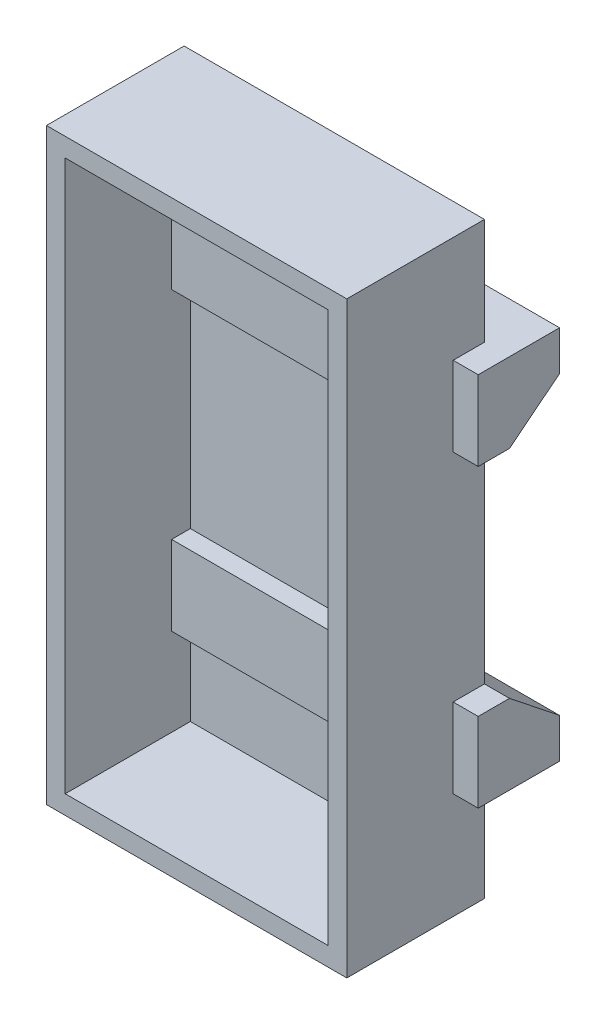
ISO-10303-21;
HEADER;
FILE_DESCRIPTION(('STEP AP214'),'2;1');
FILE_NAME('part.step','',(''),(''),'','','');
FILE_SCHEMA(('AUTOMOTIVE_DESIGN { 1 0 10303 214 1 1 1 1 }'));
ENDSEC;
DATA;
#1=APPLICATION_CONTEXT('core data for automotive mechanical design processes');
#2=APPLICATION_PROTOCOL_DEFINITION('international standard','automotive_design',2000,#1);
#3=PRODUCT_CONTEXT('',#1,'mechanical');
#4=PRODUCT('Part','Part','',(#3));
#5=PRODUCT_RELATED_PRODUCT_CATEGORY('part','',(#4));
#6=PRODUCT_DEFINITION_FORMATION('','',#4);
#7=PRODUCT_DEFINITION_CONTEXT('part definition',#1,'design');
#8=PRODUCT_DEFINITION('design','',#6,#7);
#9=PRODUCT_DEFINITION_SHAPE('','',#8);
#10=(LENGTH_UNIT() NAMED_UNIT(*) SI_UNIT(.MILLI.,.METRE.));
#11=(NAMED_UNIT(*) PLANE_ANGLE_UNIT() SI_UNIT($,.RADIAN.));
#12=(NAMED_UNIT(*) SI_UNIT($,.STERADIAN.) SOLID_ANGLE_UNIT());
#13=UNCERTAINTY_MEASURE_WITH_UNIT(LENGTH_MEASURE(1.E-05),#10,'distance_accuracy_value','');
#14=(GEOMETRIC_REPRESENTATION_CONTEXT(3) GLOBAL_UNCERTAINTY_ASSIGNED_CONTEXT((#13)) GLOBAL_UNIT_ASSIGNED_CONTEXT((#10,
#11,#12)) REPRESENTATION_CONTEXT('',''));
#15=CARTESIAN_POINT('',(0.,0.,0.));
#16=DIRECTION('',(0.,0.,1.));
#17=DIRECTION('',(1.,0.,0.));
#18=AXIS2_PLACEMENT_3D('',#15,#16,#17);
#19=CARTESIAN_POINT('',(1.1371151592628,-35.5645357115203,-4.));
#20=DIRECTION('',(0.,-1.,0.));
#21=DIRECTION('',(1.,0.,0.));
#22=AXIS2_PLACEMENT_3D('',#19,#20,#21);
#23=PLANE('',#22);
#24=DIRECTION('',(-1.,0.,0.));
#25=VECTOR('',#24,1.);
#26=CARTESIAN_POINT('',(8.13711515926281,-35.5645357115203,0.));
#27=LINE('',#26,#25);
#28=CARTESIAN_POINT('',(1.1371151592628,-35.5645357115203,0.));
#29=VERTEX_POINT('',#28);
#30=CARTESIAN_POINT('',(-0.862884840737202,-35.5645357115203,0.));
#31=VERTEX_POINT('',#30);
#32=EDGE_CURVE('E270',#29,#31,#27,.T.);
#33=ORIENTED_EDGE('',*,*,#32,.F.);
#34=DIRECTION('',(0.,0.,1.));
#35=VECTOR('',#34,1.);
#36=CARTESIAN_POINT('',(1.1371151592628,-35.5645357115203,-4.));
#37=LINE('',#36,#35);
#38=CARTESIAN_POINT('',(1.1371151592628,-35.5645357115203,2.5));
#39=VERTEX_POINT('',#38);
#40=EDGE_CURVE('E347',#29,#39,#37,.T.);
#41=ORIENTED_EDGE('',*,*,#40,.T.);
#42=DIRECTION('',(-1.,0.,0.));
#43=VECTOR('',#42,1.);
#44=CARTESIAN_POINT('',(1.1371151592628,-35.5645357115203,2.5));
#45=LINE('',#44,#43);
#46=CARTESIAN_POINT('',(-0.862884840737204,-35.5645357115203,2.5));
#47=VERTEX_POINT('',#46);
#48=EDGE_CURVE('E363',#39,#47,#45,.T.);
#49=ORIENTED_EDGE('',*,*,#48,.T.);
#50=DIRECTION('',(0.,0.,1.));
#51=VECTOR('',#50,1.);
#52=CARTESIAN_POINT('',(-0.862884840737205,-35.5645357115203,11.));
#53=LINE('',#52,#51);
#54=EDGE_CURVE('E373',#31,#47,#53,.T.);
#55=ORIENTED_EDGE('',*,*,#54,.F.);
#56=EDGE_LOOP('',(#33,#41,#49,#55));
#57=FACE_BOUND('',#56,.T.);
#58=ADVANCED_FACE('F33',(#57),#23,.T.);
#59=CARTESIAN_POINT('',(1.1371151592628,-52.858837038027,-4.));
#60=DIRECTION('',(0.,1.,0.));
#61=DIRECTION('',(-1.,0.,0.));
#62=AXIS2_PLACEMENT_3D('',#59,#60,#61);
#63=PLANE('',#62);
#64=DIRECTION('',(-1.,0.,0.));
#65=VECTOR('',#64,1.);
#66=CARTESIAN_POINT('',(8.13711515926281,-52.858837038027,0.));
#67=LINE('',#66,#65);
#68=CARTESIAN_POINT('',(-24.8628848407372,-52.858837038027,0.));
#69=VERTEX_POINT('',#68);
#70=CARTESIAN_POINT('',(-26.8628848407372,-52.858837038027,0.));
#71=VERTEX_POINT('',#70);
#72=EDGE_CURVE('E590',#69,#71,#67,.T.);
#73=ORIENTED_EDGE('',*,*,#72,.T.);
#74=DIRECTION('',(0.,0.,-1.));
#75=VECTOR('',#74,1.);
#76=CARTESIAN_POINT('',(-26.8628848407372,-52.858837038027,-3.99999999999999));
#77=LINE('',#76,#75);
#78=CARTESIAN_POINT('',(-26.8628848407372,-52.858837038027,3.00000000000001));
#79=VERTEX_POINT('',#78);
#80=EDGE_CURVE('E604',#79,#71,#77,.T.);
#81=ORIENTED_EDGE('',*,*,#80,.F.);
#82=DIRECTION('',(1.,0.,0.));
#83=VECTOR('',#82,1.);
#84=CARTESIAN_POINT('',(-26.8628848407372,-52.858837038027,3.00000000000001));
#85=LINE('',#84,#83);
#86=CARTESIAN_POINT('',(-24.8628848407372,-52.858837038027,3.00000000000001));
#87=VERTEX_POINT('',#86);
#88=EDGE_CURVE('E609',#79,#87,#85,.T.);
#89=ORIENTED_EDGE('',*,*,#88,.T.);
#90=DIRECTION('',(0.,0.,-1.));
#91=VECTOR('',#90,1.);
#92=CARTESIAN_POINT('',(-24.8628848407372,-52.858837038027,-3.99999999999999));
#93=LINE('',#92,#91);
#94=EDGE_CURVE('E602',#87,#69,#93,.T.);
#95=ORIENTED_EDGE('',*,*,#94,.T.);
#96=EDGE_LOOP('',(#73,#81,#89,#95));
#97=FACE_BOUND('',#96,.T.);
#98=ADVANCED_FACE('F629',(#97),#63,.T.);
#99=CARTESIAN_POINT('',(-24.8628848407372,-20.7116863747736,11.));
#100=DIRECTION('',(1.,0.,0.));
#101=DIRECTION('',(0.,1.,0.));
#102=AXIS2_PLACEMENT_3D('',#99,#100,#101);
#103=PLANE('',#102);
#104=DIRECTION('',(0.,0.,1.));
#105=VECTOR('',#104,1.);
#106=CARTESIAN_POINT('',(-24.8628848407372,-59.2116863747736,-3.99999999999999));
#107=LINE('',#106,#105);
#108=CARTESIAN_POINT('',(-24.8628848407372,-59.2116863747736,0.));
#109=VERTEX_POINT('',#108);
#110=CARTESIAN_POINT('',(-24.8628848407372,-59.2116863747736,3.00000000000001));
#111=VERTEX_POINT('',#110);
#112=EDGE_CURVE('E597',#109,#111,#107,.T.);
#113=ORIENTED_EDGE('',*,*,#112,.F.);
#114=DIRECTION('',(0.,-1.,0.));
#115=VECTOR('',#114,1.);
#116=CARTESIAN_POINT('',(-24.8628848407372,-20.7116863747736,0.));
#117=LINE('',#116,#115);
#118=CARTESIAN_POINT('',(-24.8628848407372,-67.7116863747736,0.));
#119=VERTEX_POINT('',#118);
#120=EDGE_CURVE('E420',#109,#119,#117,.T.);
#121=ORIENTED_EDGE('',*,*,#120,.T.);
#122=DIRECTION('',(0.,0.,-1.));
#123=VECTOR('',#122,1.);
#124=CARTESIAN_POINT('',(-24.8628848407372,-67.7116863747736,11.));
#125=LINE('',#124,#123);
#126=CARTESIAN_POINT('',(-24.8628848407372,-67.7116863747736,11.));
#127=VERTEX_POINT('',#126);
#128=EDGE_CURVE('E458',#127,#119,#125,.T.);
#129=ORIENTED_EDGE('',*,*,#128,.F.);
#130=DIRECTION('',(0.,-1.,0.));
#131=VECTOR('',#130,1.);
#132=CARTESIAN_POINT('',(-24.8628848407372,-20.7116863747736,11.));
#133=LINE('',#132,#131);
#134=CARTESIAN_POINT('',(-24.8628848407372,-20.7116863747736,11.));
#135=VERTEX_POINT('',#134);
#136=EDGE_CURVE('E427',#135,#127,#133,.T.);
#137=ORIENTED_EDGE('',*,*,#136,.F.);
#138=DIRECTION('',(0.,0.,-1.));
#139=VECTOR('',#138,1.);
#140=CARTESIAN_POINT('',(-24.8628848407372,-20.7116863747736,11.));
#141=LINE('',#140,#139);
#142=CARTESIAN_POINT('',(-24.8628848407372,-20.7116863747736,0.));
#143=VERTEX_POINT('',#142);
#144=EDGE_CURVE('E437',#135,#143,#141,.T.);
#145=ORIENTED_EDGE('',*,*,#144,.T.);
#146=CARTESIAN_POINT('',(-24.8628848407372,-29.2116863747736,0.));
#147=VERTEX_POINT('',#146);
#148=EDGE_CURVE('E438',#143,#147,#117,.T.);
#149=ORIENTED_EDGE('',*,*,#148,.T.);
#150=DIRECTION('',(0.,0.,-1.));
#151=VECTOR('',#150,1.);
#152=CARTESIAN_POINT('',(-24.8628848407372,-29.2116863747736,-4.));
#153=LINE('',#152,#151);
#154=CARTESIAN_POINT('',(-24.8628848407372,-29.2116863747736,3.));
#155=VERTEX_POINT('',#154);
#156=EDGE_CURVE('E277',#155,#147,#153,.T.);
#157=ORIENTED_EDGE('',*,*,#156,.F.);
#158=DIRECTION('',(0.,1.,0.));
#159=VECTOR('',#158,1.);
#160=CARTESIAN_POINT('',(-24.8628848407372,-29.2116863747736,3.));
#161=LINE('',#160,#159);
#162=CARTESIAN_POINT('',(-24.8628848407372,-35.5645357115203,3.));
#163=VERTEX_POINT('',#162);
#164=EDGE_CURVE('E282',#163,#155,#161,.T.);
#165=ORIENTED_EDGE('',*,*,#164,.F.);
#166=DIRECTION('',(0.,0.,1.));
#167=VECTOR('',#166,1.);
#168=CARTESIAN_POINT('',(-24.8628848407372,-35.5645357115203,-4.));
#169=LINE('',#168,#167);
#170=CARTESIAN_POINT('',(-24.8628848407372,-35.5645357115203,0.));
#171=VERTEX_POINT('',#170);
#172=EDGE_CURVE('E11',#171,#163,#169,.T.);
#173=ORIENTED_EDGE('',*,*,#172,.F.);
#174=EDGE_CURVE('E442',#171,#69,#117,.T.);
#175=ORIENTED_EDGE('',*,*,#174,.T.);
#176=ORIENTED_EDGE('',*,*,#94,.F.);
#177=DIRECTION('',(0.,1.,0.));
#178=VECTOR('',#177,1.);
#179=CARTESIAN_POINT('',(-24.8628848407372,-59.2116863747736,3.00000000000001));
#180=LINE('',#179,#178);
#181=EDGE_CURVE('E612',#111,#87,#180,.T.);
#182=ORIENTED_EDGE('',*,*,#181,.F.);
#183=EDGE_LOOP('',(#113,#121,#129,#137,#145,#149,#157,#165,#173,#175,#176,#182));
#184=FACE_BOUND('',#183,.T.);
#185=ADVANCED_FACE('F35',(#184),#103,.F.);
#186=CARTESIAN_POINT('',(0.,0.,0.));
#187=DIRECTION('',(0.,0.,1.));
#188=DIRECTION('',(1.,0.,0.));
#189=AXIS2_PLACEMENT_3D('',#186,#187,#188);
#190=PLANE('',#189);
#191=ORIENTED_EDGE('',*,*,#120,.F.);
#192=DIRECTION('',(1.,0.,0.));
#193=VECTOR('',#192,1.);
#194=CARTESIAN_POINT('',(0.,-59.2116863747736,0.));
#195=LINE('',#194,#193);
#196=CARTESIAN_POINT('',(-0.8628848407372,-59.2116863747736,0.));
#197=VERTEX_POINT('',#196);
#198=EDGE_CURVE('E335',#109,#197,#195,.T.);
#199=ORIENTED_EDGE('',*,*,#198,.T.);
#200=DIRECTION('',(0.,1.,0.));
#201=VECTOR('',#200,1.);
#202=CARTESIAN_POINT('',(-0.862884840737207,-20.7116863747736,0.));
#203=LINE('',#202,#201);
#204=CARTESIAN_POINT('',(-0.8628848407372,-67.7116863747736,0.));
#205=VERTEX_POINT('',#204);
#206=EDGE_CURVE('E445',#205,#197,#203,.T.);
#207=ORIENTED_EDGE('',*,*,#206,.F.);
#208=DIRECTION('',(1.,0.,0.));
#209=VECTOR('',#208,1.);
#210=CARTESIAN_POINT('',(-24.8628848407372,-67.7116863747736,0.));
#211=LINE('',#210,#209);
#212=EDGE_CURVE('E441',#119,#205,#211,.T.);
#213=ORIENTED_EDGE('',*,*,#212,.F.);
#214=EDGE_LOOP('',(#191,#199,#207,#213));
#215=FACE_BOUND('',#214,.T.);
#216=ADVANCED_FACE('F644',(#215),#190,.F.);
#217=CARTESIAN_POINT('',(0.,0.,0.999999999999999));
#218=DIRECTION('',(0.,0.,1.));
#219=DIRECTION('',(1.,0.,0.));
#220=AXIS2_PLACEMENT_3D('',#217,#218,#219);
#221=PLANE('',#220);
#222=DIRECTION('',(1.,0.,0.));
#223=VECTOR('',#222,1.);
#224=CARTESIAN_POINT('',(0.,-59.2116863747736,0.999999999999999));
#225=LINE('',#224,#223);
#226=CARTESIAN_POINT('',(-23.3628848407372,-59.2116863747736,0.999999999999999));
#227=VERTEX_POINT('',#226);
#228=CARTESIAN_POINT('',(-2.3628848407372,-59.2116863747736,0.999999999999999));
#229=VERTEX_POINT('',#228);
#230=EDGE_CURVE('E471',#227,#229,#225,.T.);
#231=ORIENTED_EDGE('',*,*,#230,.F.);
#232=DIRECTION('',(0.,-1.,0.));
#233=VECTOR('',#232,1.);
#234=CARTESIAN_POINT('',(-23.3628848407372,-22.2116863747736,0.999999999999999));
#235=LINE('',#234,#233);
#236=CARTESIAN_POINT('',(-23.3628848407372,-66.2116863747736,0.999999999999999));
#237=VERTEX_POINT('',#236);
#238=EDGE_CURVE('E396',#227,#237,#235,.T.);
#239=ORIENTED_EDGE('',*,*,#238,.T.);
#240=DIRECTION('',(1.,0.,0.));
#241=VECTOR('',#240,1.);
#242=CARTESIAN_POINT('',(-23.3628848407372,-66.2116863747736,0.999999999999999));
#243=LINE('',#242,#241);
#244=CARTESIAN_POINT('',(-2.36288484073719,-66.2116863747736,0.999999999999999));
#245=VERTEX_POINT('',#244);
#246=EDGE_CURVE('E394',#237,#245,#243,.T.);
#247=ORIENTED_EDGE('',*,*,#246,.T.);
#248=DIRECTION('',(0.,1.,0.));
#249=VECTOR('',#248,1.);
#250=CARTESIAN_POINT('',(-2.3628848407372,-22.2116863747736,0.999999999999999));
#251=LINE('',#250,#249);
#252=EDGE_CURVE('E400',#245,#229,#251,.T.);
#253=ORIENTED_EDGE('',*,*,#252,.T.);
#254=EDGE_LOOP('',(#231,#239,#247,#253));
#255=FACE_BOUND('',#254,.T.);
#256=ADVANCED_FACE('F528',(#255),#221,.T.);
#257=CARTESIAN_POINT('',(-0.8628848407372,-29.2116863747736,0.));
#258=VERTEX_POINT('',#257);
#259=CARTESIAN_POINT('',(-0.862884840737207,-20.7116863747736,0.));
#260=VERTEX_POINT('',#259);
#261=EDGE_CURVE('E444',#258,#260,#203,.T.);
#262=ORIENTED_EDGE('',*,*,#261,.F.);
#263=DIRECTION('',(-1.,0.,0.));
#264=VECTOR('',#263,1.);
#265=CARTESIAN_POINT('',(0.,-29.2116863747736,0.));
#266=LINE('',#265,#264);
#267=EDGE_CURVE('E380',#258,#147,#266,.T.);
#268=ORIENTED_EDGE('',*,*,#267,.T.);
#269=ORIENTED_EDGE('',*,*,#148,.F.);
#270=DIRECTION('',(-1.,0.,0.));
#271=VECTOR('',#270,1.);
#272=CARTESIAN_POINT('',(-24.8628848407372,-20.7116863747736,0.));
#273=LINE('',#272,#271);
#274=EDGE_CURVE('E431',#260,#143,#273,.T.);
#275=ORIENTED_EDGE('',*,*,#274,.F.);
#276=EDGE_LOOP('',(#262,#268,#269,#275));
#277=FACE_BOUND('',#276,.T.);
#278=ADVANCED_FACE('F560',(#277),#190,.F.);
#279=DIRECTION('',(-1.,0.,0.));
#280=VECTOR('',#279,1.);
#281=CARTESIAN_POINT('',(0.,-29.2116863747736,0.999999999999999));
#282=LINE('',#281,#280);
#283=CARTESIAN_POINT('',(-2.3628848407372,-29.2116863747736,0.999999999999999));
#284=VERTEX_POINT('',#283);
#285=CARTESIAN_POINT('',(-23.3628848407372,-29.2116863747736,0.999999999999999));
#286=VERTEX_POINT('',#285);
#287=EDGE_CURVE('E464',#284,#286,#282,.T.);
#288=ORIENTED_EDGE('',*,*,#287,.F.);
#289=CARTESIAN_POINT('',(-2.3628848407372,-22.2116863747736,0.999999999999999));
#290=VERTEX_POINT('',#289);
#291=EDGE_CURVE('E399',#284,#290,#251,.T.);
#292=ORIENTED_EDGE('',*,*,#291,.T.);
#293=DIRECTION('',(-1.,0.,0.));
#294=VECTOR('',#293,1.);
#295=CARTESIAN_POINT('',(-23.3628848407372,-22.2116863747736,0.999999999999999));
#296=LINE('',#295,#294);
#297=CARTESIAN_POINT('',(-23.3628848407372,-22.2116863747736,0.999999999999999));
#298=VERTEX_POINT('',#297);
#299=EDGE_CURVE('E403',#290,#298,#296,.T.);
#300=ORIENTED_EDGE('',*,*,#299,.T.);
#301=EDGE_CURVE('E391',#298,#286,#235,.T.);
#302=ORIENTED_EDGE('',*,*,#301,.T.);
#303=EDGE_LOOP('',(#288,#292,#300,#302));
#304=FACE_BOUND('',#303,.T.);
#305=ADVANCED_FACE('F503',(#304),#221,.T.);
#306=CARTESIAN_POINT('',(-24.8628848407372,-67.7116863747736,11.));
#307=DIRECTION('',(0.,1.,0.));
#308=DIRECTION('',(0.,0.,1.));
#309=AXIS2_PLACEMENT_3D('',#306,#307,#308);
#310=PLANE('',#309);
#311=ORIENTED_EDGE('',*,*,#212,.T.);
#312=DIRECTION('',(0.,0.,-1.));
#313=VECTOR('',#312,1.);
#314=CARTESIAN_POINT('',(-0.8628848407372,-67.7116863747736,11.));
#315=LINE('',#314,#313);
#316=CARTESIAN_POINT('',(-0.8628848407372,-67.7116863747736,11.));
#317=VERTEX_POINT('',#316);
#318=EDGE_CURVE('E455',#317,#205,#315,.T.);
#319=ORIENTED_EDGE('',*,*,#318,.F.);
#320=DIRECTION('',(1.,0.,0.));
#321=VECTOR('',#320,1.);
#322=CARTESIAN_POINT('',(-24.8628848407372,-67.7116863747736,11.));
#323=LINE('',#322,#321);
#324=EDGE_CURVE('E430',#127,#317,#323,.T.);
#325=ORIENTED_EDGE('',*,*,#324,.F.);
#326=ORIENTED_EDGE('',*,*,#128,.T.);
#327=EDGE_LOOP('',(#311,#319,#325,#326));
#328=FACE_BOUND('',#327,.T.);
#329=ADVANCED_FACE('F549',(#328),#310,.F.);
#330=CARTESIAN_POINT('',(-0.862884840737207,-20.7116863747736,11.));
#331=DIRECTION('',(-1.,0.,0.));
#332=DIRECTION('',(0.,-1.,0.));
#333=AXIS2_PLACEMENT_3D('',#330,#331,#332);
#334=PLANE('',#333);
#335=ORIENTED_EDGE('',*,*,#206,.T.);
#336=DIRECTION('',(0.,0.,1.));
#337=VECTOR('',#336,1.);
#338=CARTESIAN_POINT('',(-0.862884840737201,-59.2116863747736,11.));
#339=LINE('',#338,#337);
#340=CARTESIAN_POINT('',(-0.862884840737201,-59.2116863747736,2.5));
#341=VERTEX_POINT('',#340);
#342=EDGE_CURVE('E338',#197,#341,#339,.T.);
#343=ORIENTED_EDGE('',*,*,#342,.T.);
#344=DIRECTION('',(0.,1.,0.));
#345=VECTOR('',#344,1.);
#346=CARTESIAN_POINT('',(-0.862884840737207,-20.7116863747736,2.5));
#347=LINE('',#346,#345);
#348=CARTESIAN_POINT('',(-0.862884840737201,-52.858837038027,2.5));
#349=VERTEX_POINT('',#348);
#350=EDGE_CURVE('E343',#341,#349,#347,.T.);
#351=ORIENTED_EDGE('',*,*,#350,.T.);
#352=DIRECTION('',(0.,0.,-1.));
#353=VECTOR('',#352,1.);
#354=CARTESIAN_POINT('',(-0.862884840737202,-52.858837038027,11.));
#355=LINE('',#354,#353);
#356=CARTESIAN_POINT('',(-0.8628848407372,-52.858837038027,0.));
#357=VERTEX_POINT('',#356);
#358=EDGE_CURVE('E328',#349,#357,#355,.T.);
#359=ORIENTED_EDGE('',*,*,#358,.T.);
#360=EDGE_CURVE('E448',#357,#31,#203,.T.);
#361=ORIENTED_EDGE('',*,*,#360,.T.);
#362=ORIENTED_EDGE('',*,*,#54,.T.);
#363=DIRECTION('',(0.,1.,0.));
#364=VECTOR('',#363,1.);
#365=CARTESIAN_POINT('',(-0.862884840737207,-20.7116863747736,2.5));
#366=LINE('',#365,#364);
#367=CARTESIAN_POINT('',(-0.862884840737204,-29.2116863747736,2.5));
#368=VERTEX_POINT('',#367);
#369=EDGE_CURVE('E387',#47,#368,#366,.T.);
#370=ORIENTED_EDGE('',*,*,#369,.T.);
#371=DIRECTION('',(0.,0.,-1.));
#372=VECTOR('',#371,1.);
#373=CARTESIAN_POINT('',(-0.862884840737206,-29.2116863747736,11.));
#374=LINE('',#373,#372);
#375=EDGE_CURVE('E382',#368,#258,#374,.T.);
#376=ORIENTED_EDGE('',*,*,#375,.T.);
#377=ORIENTED_EDGE('',*,*,#261,.T.);
#378=DIRECTION('',(0.,0.,-1.));
#379=VECTOR('',#378,1.);
#380=CARTESIAN_POINT('',(-0.862884840737207,-20.7116863747736,11.));
#381=LINE('',#380,#379);
#382=CARTESIAN_POINT('',(-0.862884840737207,-20.7116863747736,11.));
#383=VERTEX_POINT('',#382);
#384=EDGE_CURVE('E452',#383,#260,#381,.T.);
#385=ORIENTED_EDGE('',*,*,#384,.F.);
#386=DIRECTION('',(0.,1.,0.));
#387=VECTOR('',#386,1.);
#388=CARTESIAN_POINT('',(-0.862884840737207,-20.7116863747736,11.));
#389=LINE('',#388,#387);
#390=EDGE_CURVE('E433',#317,#383,#389,.T.);
#391=ORIENTED_EDGE('',*,*,#390,.F.);
#392=ORIENTED_EDGE('',*,*,#318,.T.);
#393=EDGE_LOOP('',(#335,#343,#351,#359,#361,#362,#370,#376,#377,#385,#391,#392));
#394=FACE_BOUND('',#393,.T.);
#395=ADVANCED_FACE('F554',(#394),#334,.F.);
#396=CARTESIAN_POINT('',(-24.8628848407372,-20.7116863747736,11.));
#397=DIRECTION('',(0.,-1.,0.));
#398=DIRECTION('',(0.,0.,-1.));
#399=AXIS2_PLACEMENT_3D('',#396,#397,#398);
#400=PLANE('',#399);
#401=ORIENTED_EDGE('',*,*,#274,.T.);
#402=ORIENTED_EDGE('',*,*,#144,.F.);
#403=DIRECTION('',(-1.,0.,0.));
#404=VECTOR('',#403,1.);
#405=CARTESIAN_POINT('',(-24.8628848407372,-20.7116863747736,11.));
#406=LINE('',#405,#404);
#407=EDGE_CURVE('E435',#383,#135,#406,.T.);
#408=ORIENTED_EDGE('',*,*,#407,.F.);
#409=ORIENTED_EDGE('',*,*,#384,.T.);
#410=EDGE_LOOP('',(#401,#402,#408,#409));
#411=FACE_BOUND('',#410,.T.);
#412=ADVANCED_FACE('F538',(#411),#400,.F.);
#413=CARTESIAN_POINT('',(0.,0.,11.));
#414=DIRECTION('',(0.,0.,1.));
#415=DIRECTION('',(1.,0.,0.));
#416=AXIS2_PLACEMENT_3D('',#413,#414,#415);
#417=PLANE('',#416);
#418=DIRECTION('',(0.,-1.,0.));
#419=VECTOR('',#418,1.);
#420=CARTESIAN_POINT('',(-23.3628848407372,-22.2116863747736,11.));
#421=LINE('',#420,#419);
#422=CARTESIAN_POINT('',(-23.3628848407372,-22.2116863747736,11.));
#423=VERTEX_POINT('',#422);
#424=CARTESIAN_POINT('',(-23.3628848407372,-66.2116863747736,11.));
#425=VERTEX_POINT('',#424);
#426=EDGE_CURVE('E390',#423,#425,#421,.T.);
#427=ORIENTED_EDGE('',*,*,#426,.F.);
#428=DIRECTION('',(-1.,0.,0.));
#429=VECTOR('',#428,1.);
#430=CARTESIAN_POINT('',(-23.3628848407372,-22.2116863747736,11.));
#431=LINE('',#430,#429);
#432=CARTESIAN_POINT('',(-2.3628848407372,-22.2116863747736,11.));
#433=VERTEX_POINT('',#432);
#434=EDGE_CURVE('E415',#433,#423,#431,.T.);
#435=ORIENTED_EDGE('',*,*,#434,.F.);
#436=DIRECTION('',(0.,1.,0.));
#437=VECTOR('',#436,1.);
#438=CARTESIAN_POINT('',(-2.3628848407372,-22.2116863747736,11.));
#439=LINE('',#438,#437);
#440=CARTESIAN_POINT('',(-2.36288484073719,-66.2116863747736,11.));
#441=VERTEX_POINT('',#440);
#442=EDGE_CURVE('E412',#441,#433,#439,.T.);
#443=ORIENTED_EDGE('',*,*,#442,.F.);
#444=DIRECTION('',(1.,0.,0.));
#445=VECTOR('',#444,1.);
#446=CARTESIAN_POINT('',(-23.3628848407372,-66.2116863747736,11.));
#447=LINE('',#446,#445);
#448=EDGE_CURVE('E409',#425,#441,#447,.T.);
#449=ORIENTED_EDGE('',*,*,#448,.F.);
#450=EDGE_LOOP('',(#427,#435,#443,#449));
#451=FACE_BOUND('',#450,.T.);
#452=ORIENTED_EDGE('',*,*,#136,.T.);
#453=ORIENTED_EDGE('',*,*,#324,.T.);
#454=ORIENTED_EDGE('',*,*,#390,.T.);
#455=ORIENTED_EDGE('',*,*,#407,.T.);
#456=EDGE_LOOP('',(#452,#453,#454,#455));
#457=FACE_BOUND('',#456,.T.);
#458=ADVANCED_FACE('F534',(#451,#457),#417,.T.);
#459=ORIENTED_EDGE('',*,*,#360,.F.);
#460=DIRECTION('',(-1.,0.,0.));
#461=VECTOR('',#460,1.);
#462=CARTESIAN_POINT('',(0.,-52.858837038027,0.));
#463=LINE('',#462,#461);
#464=EDGE_CURVE('E325',#357,#69,#463,.T.);
#465=ORIENTED_EDGE('',*,*,#464,.T.);
#466=ORIENTED_EDGE('',*,*,#174,.F.);
#467=DIRECTION('',(1.,0.,0.));
#468=VECTOR('',#467,1.);
#469=CARTESIAN_POINT('',(0.,-35.5645357115203,0.));
#470=LINE('',#469,#468);
#471=EDGE_CURVE('E370',#171,#31,#470,.T.);
#472=ORIENTED_EDGE('',*,*,#471,.T.);
#473=EDGE_LOOP('',(#459,#465,#466,#472));
#474=FACE_BOUND('',#473,.T.);
#475=ADVANCED_FACE('F537',(#474),#190,.F.);
#476=CARTESIAN_POINT('',(-23.3628848407372,-22.2116863747736,0.999999999999999));
#477=DIRECTION('',(-1.,0.,0.));
#478=DIRECTION('',(0.,-1.,0.));
#479=AXIS2_PLACEMENT_3D('',#476,#477,#478);
#480=PLANE('',#479);
#481=ORIENTED_EDGE('',*,*,#238,.F.);
#482=DIRECTION('',(0.,0.,1.));
#483=VECTOR('',#482,1.);
#484=CARTESIAN_POINT('',(-23.3628848407372,-59.2116863747736,0.999999999999999));
#485=LINE('',#484,#483);
#486=CARTESIAN_POINT('',(-23.3628848407372,-59.2116863747736,2.5));
#487=VERTEX_POINT('',#486);
#488=EDGE_CURVE('E333',#227,#487,#485,.T.);
#489=ORIENTED_EDGE('',*,*,#488,.T.);
#490=DIRECTION('',(0.,1.,0.));
#491=VECTOR('',#490,1.);
#492=CARTESIAN_POINT('',(-23.3628848407372,-22.2116863747736,2.5));
#493=LINE('',#492,#491);
#494=CARTESIAN_POINT('',(-23.3628848407372,-52.858837038027,2.5));
#495=VERTEX_POINT('',#494);
#496=EDGE_CURVE('E341',#487,#495,#493,.T.);
#497=ORIENTED_EDGE('',*,*,#496,.T.);
#498=DIRECTION('',(0.,0.,-1.));
#499=VECTOR('',#498,1.);
#500=CARTESIAN_POINT('',(-23.3628848407372,-52.858837038027,0.999999999999999));
#501=LINE('',#500,#499);
#502=CARTESIAN_POINT('',(-23.3628848407372,-52.858837038027,0.999999999999999));
#503=VERTEX_POINT('',#502);
#504=EDGE_CURVE('E322',#495,#503,#501,.T.);
#505=ORIENTED_EDGE('',*,*,#504,.T.);
#506=CARTESIAN_POINT('',(-23.3628848407372,-35.5645357115203,0.999999999999999));
#507=VERTEX_POINT('',#506);
#508=EDGE_CURVE('E395',#507,#503,#235,.T.);
#509=ORIENTED_EDGE('',*,*,#508,.F.);
#510=DIRECTION('',(0.,0.,1.));
#511=VECTOR('',#510,1.);
#512=CARTESIAN_POINT('',(-23.3628848407372,-35.5645357115203,0.999999999999999));
#513=LINE('',#512,#511);
#514=CARTESIAN_POINT('',(-23.3628848407372,-35.5645357115203,2.5));
#515=VERTEX_POINT('',#514);
#516=EDGE_CURVE('E368',#507,#515,#513,.T.);
#517=ORIENTED_EDGE('',*,*,#516,.T.);
#518=DIRECTION('',(0.,1.,0.));
#519=VECTOR('',#518,1.);
#520=CARTESIAN_POINT('',(-23.3628848407372,-22.2116863747736,2.5));
#521=LINE('',#520,#519);
#522=CARTESIAN_POINT('',(-23.3628848407372,-29.2116863747736,2.5));
#523=VERTEX_POINT('',#522);
#524=EDGE_CURVE('E385',#515,#523,#521,.T.);
#525=ORIENTED_EDGE('',*,*,#524,.T.);
#526=DIRECTION('',(0.,0.,-1.));
#527=VECTOR('',#526,1.);
#528=CARTESIAN_POINT('',(-23.3628848407372,-29.2116863747736,0.999999999999999));
#529=LINE('',#528,#527);
#530=EDGE_CURVE('E378',#523,#286,#529,.T.);
#531=ORIENTED_EDGE('',*,*,#530,.T.);
#532=ORIENTED_EDGE('',*,*,#301,.F.);
#533=DIRECTION('',(0.,0.,1.));
#534=VECTOR('',#533,1.);
#535=CARTESIAN_POINT('',(-23.3628848407372,-22.2116863747736,0.999999999999999));
#536=LINE('',#535,#534);
#537=EDGE_CURVE('E418',#298,#423,#536,.T.);
#538=ORIENTED_EDGE('',*,*,#537,.T.);
#539=ORIENTED_EDGE('',*,*,#426,.T.);
#540=DIRECTION('',(0.,0.,1.));
#541=VECTOR('',#540,1.);
#542=CARTESIAN_POINT('',(-23.3628848407372,-66.2116863747736,0.999999999999999));
#543=LINE('',#542,#541);
#544=EDGE_CURVE('E407',#237,#425,#543,.T.);
#545=ORIENTED_EDGE('',*,*,#544,.F.);
#546=EDGE_LOOP('',(#481,#489,#497,#505,#509,#517,#525,#531,#532,#538,#539,#545));
#547=FACE_BOUND('',#546,.T.);
#548=ADVANCED_FACE('F493',(#547),#480,.F.);
#549=CARTESIAN_POINT('',(-23.3628848407372,-22.2116863747736,0.999999999999999));
#550=DIRECTION('',(0.,1.,0.));
#551=DIRECTION('',(0.,0.,1.));
#552=AXIS2_PLACEMENT_3D('',#549,#550,#551);
#553=PLANE('',#552);
#554=ORIENTED_EDGE('',*,*,#434,.T.);
#555=ORIENTED_EDGE('',*,*,#537,.F.);
#556=ORIENTED_EDGE('',*,*,#299,.F.);
#557=DIRECTION('',(0.,0.,1.));
#558=VECTOR('',#557,1.);
#559=CARTESIAN_POINT('',(-2.3628848407372,-22.2116863747736,0.999999999999999));
#560=LINE('',#559,#558);
#561=EDGE_CURVE('E421',#290,#433,#560,.T.);
#562=ORIENTED_EDGE('',*,*,#561,.T.);
#563=EDGE_LOOP('',(#554,#555,#556,#562));
#564=FACE_BOUND('',#563,.T.);
#565=ADVANCED_FACE('F509',(#564),#553,.F.);
#566=CARTESIAN_POINT('',(-2.3628848407372,-22.2116863747736,0.999999999999999));
#567=DIRECTION('',(1.,0.,0.));
#568=DIRECTION('',(0.,1.,0.));
#569=AXIS2_PLACEMENT_3D('',#566,#567,#568);
#570=PLANE('',#569);
#571=DIRECTION('',(0.,-1.,0.));
#572=VECTOR('',#571,1.);
#573=CARTESIAN_POINT('',(-2.3628848407372,-22.2116863747736,2.5));
#574=LINE('',#573,#572);
#575=CARTESIAN_POINT('',(-2.3628848407372,-52.858837038027,2.5));
#576=VERTEX_POINT('',#575);
#577=CARTESIAN_POINT('',(-2.3628848407372,-59.2116863747736,2.5));
#578=VERTEX_POINT('',#577);
#579=EDGE_CURVE('E37',#576,#578,#574,.T.);
#580=ORIENTED_EDGE('',*,*,#579,.T.);
#581=DIRECTION('',(0.,0.,-1.));
#582=VECTOR('',#581,1.);
#583=CARTESIAN_POINT('',(-2.3628848407372,-59.2116863747736,0.999999999999999));
#584=LINE('',#583,#582);
#585=EDGE_CURVE('E331',#578,#229,#584,.T.);
#586=ORIENTED_EDGE('',*,*,#585,.T.);
#587=ORIENTED_EDGE('',*,*,#252,.F.);
#588=DIRECTION('',(0.,0.,1.));
#589=VECTOR('',#588,1.);
#590=CARTESIAN_POINT('',(-2.36288484073719,-66.2116863747736,0.999999999999999));
#591=LINE('',#590,#589);
#592=EDGE_CURVE('E423',#245,#441,#591,.T.);
#593=ORIENTED_EDGE('',*,*,#592,.T.);
#594=ORIENTED_EDGE('',*,*,#442,.T.);
#595=ORIENTED_EDGE('',*,*,#561,.F.);
#596=ORIENTED_EDGE('',*,*,#291,.F.);
#597=DIRECTION('',(0.,0.,1.));
#598=VECTOR('',#597,1.);
#599=CARTESIAN_POINT('',(-2.3628848407372,-29.2116863747736,0.999999999999999));
#600=LINE('',#599,#598);
#601=CARTESIAN_POINT('',(-2.3628848407372,-29.2116863747736,2.5));
#602=VERTEX_POINT('',#601);
#603=EDGE_CURVE('E376',#284,#602,#600,.T.);
#604=ORIENTED_EDGE('',*,*,#603,.T.);
#605=DIRECTION('',(0.,-1.,0.));
#606=VECTOR('',#605,1.);
#607=CARTESIAN_POINT('',(-2.3628848407372,-22.2116863747736,2.5));
#608=LINE('',#607,#606);
#609=CARTESIAN_POINT('',(-2.3628848407372,-35.5645357115203,2.5));
#610=VERTEX_POINT('',#609);
#611=EDGE_CURVE('E467',#602,#610,#608,.T.);
#612=ORIENTED_EDGE('',*,*,#611,.T.);
#613=DIRECTION('',(0.,0.,-1.));
#614=VECTOR('',#613,1.);
#615=CARTESIAN_POINT('',(-2.3628848407372,-35.5645357115203,0.999999999999999));
#616=LINE('',#615,#614);
#617=CARTESIAN_POINT('',(-2.36288484073719,-35.5645357115203,0.999999999999999));
#618=VERTEX_POINT('',#617);
#619=EDGE_CURVE('E358',#610,#618,#616,.T.);
#620=ORIENTED_EDGE('',*,*,#619,.T.);
#621=CARTESIAN_POINT('',(-2.3628848407372,-52.858837038027,0.999999999999999));
#622=VERTEX_POINT('',#621);
#623=EDGE_CURVE('E404',#622,#618,#251,.T.);
#624=ORIENTED_EDGE('',*,*,#623,.F.);
#625=DIRECTION('',(0.,0.,1.));
#626=VECTOR('',#625,1.);
#627=CARTESIAN_POINT('',(-2.3628848407372,-52.858837038027,0.999999999999999));
#628=LINE('',#627,#626);
#629=EDGE_CURVE('E313',#622,#576,#628,.T.);
#630=ORIENTED_EDGE('',*,*,#629,.T.);
#631=EDGE_LOOP('',(#580,#586,#587,#593,#594,#595,#596,#604,#612,#620,#624,#630));
#632=FACE_BOUND('',#631,.T.);
#633=ADVANCED_FACE('F478',(#632),#570,.F.);
#634=CARTESIAN_POINT('',(-23.3628848407372,-66.2116863747736,0.999999999999999));
#635=DIRECTION('',(0.,-1.,0.));
#636=DIRECTION('',(0.,0.,-1.));
#637=AXIS2_PLACEMENT_3D('',#634,#635,#636);
#638=PLANE('',#637);
#639=ORIENTED_EDGE('',*,*,#448,.T.);
#640=ORIENTED_EDGE('',*,*,#592,.F.);
#641=ORIENTED_EDGE('',*,*,#246,.F.);
#642=ORIENTED_EDGE('',*,*,#544,.T.);
#643=EDGE_LOOP('',(#639,#640,#641,#642));
#644=FACE_BOUND('',#643,.T.);
#645=ADVANCED_FACE('F532',(#644),#638,.F.);
#646=DIRECTION('',(-1.,0.,0.));
#647=VECTOR('',#646,1.);
#648=CARTESIAN_POINT('',(0.,-52.858837038027,0.999999999999999));
#649=LINE('',#648,#647);
#650=EDGE_CURVE('E469',#622,#503,#649,.T.);
#651=ORIENTED_EDGE('',*,*,#650,.F.);
#652=ORIENTED_EDGE('',*,*,#623,.T.);
#653=DIRECTION('',(1.,0.,0.));
#654=VECTOR('',#653,1.);
#655=CARTESIAN_POINT('',(0.,-35.5645357115203,0.999999999999999));
#656=LINE('',#655,#654);
#657=EDGE_CURVE('E461',#507,#618,#656,.T.);
#658=ORIENTED_EDGE('',*,*,#657,.F.);
#659=ORIENTED_EDGE('',*,*,#508,.T.);
#660=EDGE_LOOP('',(#651,#652,#658,#659));
#661=FACE_BOUND('',#660,.T.);
#662=ADVANCED_FACE('F498',(#661),#221,.T.);
#663=CARTESIAN_POINT('',(1.1371151592628,-29.2116863747736,-4.));
#664=DIRECTION('',(0.,1.,0.));
#665=DIRECTION('',(-1.,0.,0.));
#666=AXIS2_PLACEMENT_3D('',#663,#664,#665);
#667=PLANE('',#666);
#668=ORIENTED_EDGE('',*,*,#530,.F.);
#669=DIRECTION('',(-1.,0.,0.));
#670=VECTOR('',#669,1.);
#671=CARTESIAN_POINT('',(1.1371151592628,-29.2116863747736,2.5));
#672=LINE('',#671,#670);
#673=EDGE_CURVE('E362',#602,#523,#672,.T.);
#674=ORIENTED_EDGE('',*,*,#673,.F.);
#675=ORIENTED_EDGE('',*,*,#603,.F.);
#676=ORIENTED_EDGE('',*,*,#287,.T.);
#677=EDGE_LOOP('',(#668,#674,#675,#676));
#678=FACE_BOUND('',#677,.T.);
#679=ADVANCED_FACE('F514',(#678),#667,.T.);
#680=ORIENTED_EDGE('',*,*,#516,.F.);
#681=ORIENTED_EDGE('',*,*,#657,.T.);
#682=ORIENTED_EDGE('',*,*,#619,.F.);
#683=EDGE_CURVE('E355',#610,#515,#45,.T.);
#684=ORIENTED_EDGE('',*,*,#683,.T.);
#685=EDGE_LOOP('',(#680,#681,#682,#684));
#686=FACE_BOUND('',#685,.T.);
#687=ADVANCED_FACE('F525',(#686),#23,.T.);
#688=CARTESIAN_POINT('',(1.1371151592628,-29.2116863747736,2.5));
#689=DIRECTION('',(0.,0.,1.));
#690=DIRECTION('',(0.,-1.,0.));
#691=AXIS2_PLACEMENT_3D('',#688,#689,#690);
#692=PLANE('',#691);
#693=ORIENTED_EDGE('',*,*,#524,.F.);
#694=ORIENTED_EDGE('',*,*,#683,.F.);
#695=ORIENTED_EDGE('',*,*,#611,.F.);
#696=ORIENTED_EDGE('',*,*,#673,.T.);
#697=EDGE_LOOP('',(#693,#694,#695,#696));
#698=FACE_BOUND('',#697,.T.);
#699=ADVANCED_FACE('F521',(#698),#692,.T.);
#700=ORIENTED_EDGE('',*,*,#369,.F.);
#701=ORIENTED_EDGE('',*,*,#48,.F.);
#702=DIRECTION('',(0.,1.,0.));
#703=VECTOR('',#702,1.);
#704=CARTESIAN_POINT('',(1.1371151592628,-29.2116863747736,2.5));
#705=LINE('',#704,#703);
#706=CARTESIAN_POINT('',(1.1371151592628,-29.2116863747736,2.5));
#707=VERTEX_POINT('',#706);
#708=EDGE_CURVE('E349',#39,#707,#705,.T.);
#709=ORIENTED_EDGE('',*,*,#708,.T.);
#710=EDGE_CURVE('E359',#707,#368,#672,.T.);
#711=ORIENTED_EDGE('',*,*,#710,.T.);
#712=EDGE_LOOP('',(#700,#701,#709,#711));
#713=FACE_BOUND('',#712,.T.);
#714=ADVANCED_FACE('F567',(#713),#692,.T.);
#715=ORIENTED_EDGE('',*,*,#375,.F.);
#716=ORIENTED_EDGE('',*,*,#710,.F.);
#717=DIRECTION('',(0.,0.,-1.));
#718=VECTOR('',#717,1.);
#719=CARTESIAN_POINT('',(1.1371151592628,-29.2116863747736,-4.));
#720=LINE('',#719,#718);
#721=CARTESIAN_POINT('',(1.1371151592628,-29.2116863747736,-4.));
#722=VERTEX_POINT('',#721);
#723=EDGE_CURVE('E352',#707,#722,#720,.T.);
#724=ORIENTED_EDGE('',*,*,#723,.T.);
#725=DIRECTION('',(-1.,0.,0.));
#726=VECTOR('',#725,1.);
#727=CARTESIAN_POINT('',(1.1371151592628,-29.2116863747736,-4.));
#728=LINE('',#727,#726);
#729=CARTESIAN_POINT('',(-26.8628848407372,-29.2116863747736,-4.));
#730=VERTEX_POINT('',#729);
#731=EDGE_CURVE('E356',#722,#730,#728,.T.);
#732=ORIENTED_EDGE('',*,*,#731,.T.);
#733=DIRECTION('',(0.,0.,-1.));
#734=VECTOR('',#733,1.);
#735=CARTESIAN_POINT('',(-26.8628848407372,-29.2116863747736,-4.));
#736=LINE('',#735,#734);
#737=CARTESIAN_POINT('',(-26.8628848407372,-29.2116863747736,3.));
#738=VERTEX_POINT('',#737);
#739=EDGE_CURVE('E275',#738,#730,#736,.T.);
#740=ORIENTED_EDGE('',*,*,#739,.F.);
#741=DIRECTION('',(1.,0.,0.));
#742=VECTOR('',#741,1.);
#743=CARTESIAN_POINT('',(-26.8628848407372,-29.2116863747736,3.));
#744=LINE('',#743,#742);
#745=EDGE_CURVE('E289',#738,#155,#744,.T.);
#746=ORIENTED_EDGE('',*,*,#745,.T.);
#747=ORIENTED_EDGE('',*,*,#156,.T.);
#748=ORIENTED_EDGE('',*,*,#267,.F.);
#749=EDGE_LOOP('',(#715,#716,#724,#732,#740,#746,#747,#748));
#750=FACE_BOUND('',#749,.T.);
#751=ADVANCED_FACE('F562',(#750),#667,.T.);
#752=CARTESIAN_POINT('',(-26.8628848407372,-35.5645357115203,0.));
#753=VERTEX_POINT('',#752);
#754=EDGE_CURVE('E49',#171,#753,#27,.T.);
#755=ORIENTED_EDGE('',*,*,#754,.F.);
#756=ORIENTED_EDGE('',*,*,#172,.T.);
#757=DIRECTION('',(1.,0.,0.));
#758=VECTOR('',#757,1.);
#759=CARTESIAN_POINT('',(-26.8628848407372,-35.5645357115203,3.));
#760=LINE('',#759,#758);
#761=CARTESIAN_POINT('',(-26.8628848407372,-35.5645357115203,3.));
#762=VERTEX_POINT('',#761);
#763=EDGE_CURVE('E295',#762,#163,#760,.T.);
#764=ORIENTED_EDGE('',*,*,#763,.F.);
#765=DIRECTION('',(0.,0.,1.));
#766=VECTOR('',#765,1.);
#767=CARTESIAN_POINT('',(-26.8628848407372,-35.5645357115203,-4.));
#768=LINE('',#767,#766);
#769=EDGE_CURVE('E276',#753,#762,#768,.T.);
#770=ORIENTED_EDGE('',*,*,#769,.F.);
#771=EDGE_LOOP('',(#755,#756,#764,#770));
#772=FACE_BOUND('',#771,.T.);
#773=ADVANCED_FACE('F585',(#772),#23,.T.);
#774=CARTESIAN_POINT('',(1.1371151592628,-29.2116863747736,-4.));
#775=DIRECTION('',(0.,0.,-1.));
#776=DIRECTION('',(0.,1.,0.));
#777=AXIS2_PLACEMENT_3D('',#774,#775,#776);
#778=PLANE('',#777);
#779=DIRECTION('',(-1.,0.,0.));
#780=VECTOR('',#779,1.);
#781=CARTESIAN_POINT('',(8.13711515926281,-32.3881110431469,-4.));
#782=LINE('',#781,#780);
#783=CARTESIAN_POINT('',(1.1371151592628,-32.3881110431469,-4.));
#784=VERTEX_POINT('',#783);
#785=CARTESIAN_POINT('',(-26.8628848407372,-32.3881110431469,-4.));
#786=VERTEX_POINT('',#785);
#787=EDGE_CURVE('E255',#784,#786,#782,.T.);
#788=ORIENTED_EDGE('',*,*,#787,.T.);
#789=DIRECTION('',(0.,-1.,0.));
#790=VECTOR('',#789,1.);
#791=CARTESIAN_POINT('',(-26.8628848407372,-29.2116863747736,-4.));
#792=LINE('',#791,#790);
#793=EDGE_CURVE('E266',#730,#786,#792,.T.);
#794=ORIENTED_EDGE('',*,*,#793,.F.);
#795=ORIENTED_EDGE('',*,*,#731,.F.);
#796=DIRECTION('',(0.,-1.,0.));
#797=VECTOR('',#796,1.);
#798=CARTESIAN_POINT('',(1.1371151592628,-29.2116863747736,-4.));
#799=LINE('',#798,#797);
#800=EDGE_CURVE('E268',#722,#784,#799,.T.);
#801=ORIENTED_EDGE('',*,*,#800,.T.);
#802=EDGE_LOOP('',(#788,#794,#795,#801));
#803=FACE_BOUND('',#802,.T.);
#804=ADVANCED_FACE('F265',(#803),#778,.T.);
#805=CARTESIAN_POINT('',(1.1371151592628,0.,0.));
#806=DIRECTION('',(-1.,0.,0.));
#807=DIRECTION('',(0.,0.,1.));
#808=AXIS2_PLACEMENT_3D('',#805,#806,#807);
#809=PLANE('',#808);
#810=ORIENTED_EDGE('',*,*,#40,.F.);
#811=DIRECTION('',(0.,0.621876630272144,-0.783115225698851));
#812=VECTOR('',#811,1.);
#813=CARTESIAN_POINT('',(1.1371151592628,-21.8106434943515,-17.3199665071386));
#814=LINE('',#813,#812);
#815=EDGE_CURVE('E574',#29,#784,#814,.T.);
#816=ORIENTED_EDGE('',*,*,#815,.T.);
#817=ORIENTED_EDGE('',*,*,#800,.F.);
#818=ORIENTED_EDGE('',*,*,#723,.F.);
#819=ORIENTED_EDGE('',*,*,#708,.F.);
#820=EDGE_LOOP('',(#810,#816,#817,#818,#819));
#821=FACE_BOUND('',#820,.T.);
#822=ADVANCED_FACE('F573',(#821),#809,.F.);
#823=ORIENTED_EDGE('',*,*,#504,.F.);
#824=DIRECTION('',(-1.,0.,0.));
#825=VECTOR('',#824,1.);
#826=CARTESIAN_POINT('',(1.1371151592628,-52.858837038027,2.5));
#827=LINE('',#826,#825);
#828=EDGE_CURVE('E317',#576,#495,#827,.T.);
#829=ORIENTED_EDGE('',*,*,#828,.F.);
#830=ORIENTED_EDGE('',*,*,#629,.F.);
#831=ORIENTED_EDGE('',*,*,#650,.T.);
#832=EDGE_LOOP('',(#823,#829,#830,#831));
#833=FACE_BOUND('',#832,.T.);
#834=ADVANCED_FACE('F496',(#833),#63,.T.);
#835=CARTESIAN_POINT('',(1.1371151592628,-59.2116863747736,-4.));
#836=DIRECTION('',(0.,-1.,0.));
#837=DIRECTION('',(1.,0.,0.));
#838=AXIS2_PLACEMENT_3D('',#835,#836,#837);
#839=PLANE('',#838);
#840=ORIENTED_EDGE('',*,*,#488,.F.);
#841=ORIENTED_EDGE('',*,*,#230,.T.);
#842=ORIENTED_EDGE('',*,*,#585,.F.);
#843=DIRECTION('',(-1.,0.,0.));
#844=VECTOR('',#843,1.);
#845=CARTESIAN_POINT('',(1.1371151592628,-59.2116863747736,2.5));
#846=LINE('',#845,#844);
#847=EDGE_CURVE('E309',#578,#487,#846,.T.);
#848=ORIENTED_EDGE('',*,*,#847,.T.);
#849=EDGE_LOOP('',(#840,#841,#842,#848));
#850=FACE_BOUND('',#849,.T.);
#851=ADVANCED_FACE('F487',(#850),#839,.T.);
#852=CARTESIAN_POINT('',(1.1371151592628,-59.2116863747736,2.5));
#853=DIRECTION('',(0.,0.,1.));
#854=DIRECTION('',(0.,-1.,0.));
#855=AXIS2_PLACEMENT_3D('',#852,#853,#854);
#856=PLANE('',#855);
#857=ORIENTED_EDGE('',*,*,#496,.F.);
#858=ORIENTED_EDGE('',*,*,#847,.F.);
#859=ORIENTED_EDGE('',*,*,#579,.F.);
#860=ORIENTED_EDGE('',*,*,#828,.T.);
#861=EDGE_LOOP('',(#857,#858,#859,#860));
#862=FACE_BOUND('',#861,.T.);
#863=ADVANCED_FACE('F489',(#862),#856,.T.);
#864=ORIENTED_EDGE('',*,*,#350,.F.);
#865=CARTESIAN_POINT('',(1.1371151592628,-59.2116863747736,2.5));
#866=VERTEX_POINT('',#865);
#867=EDGE_CURVE('E318',#866,#341,#846,.T.);
#868=ORIENTED_EDGE('',*,*,#867,.F.);
#869=DIRECTION('',(0.,1.,0.));
#870=VECTOR('',#869,1.);
#871=CARTESIAN_POINT('',(1.1371151592628,-59.2116863747736,2.5));
#872=LINE('',#871,#870);
#873=CARTESIAN_POINT('',(1.1371151592628,-52.858837038027,2.5));
#874=VERTEX_POINT('',#873);
#875=EDGE_CURVE('E301',#866,#874,#872,.T.);
#876=ORIENTED_EDGE('',*,*,#875,.T.);
#877=EDGE_CURVE('E314',#874,#349,#827,.T.);
#878=ORIENTED_EDGE('',*,*,#877,.T.);
#879=EDGE_LOOP('',(#864,#868,#876,#878));
#880=FACE_BOUND('',#879,.T.);
#881=ADVANCED_FACE('F642',(#880),#856,.T.);
#882=ORIENTED_EDGE('',*,*,#342,.F.);
#883=ORIENTED_EDGE('',*,*,#198,.F.);
#884=ORIENTED_EDGE('',*,*,#112,.T.);
#885=DIRECTION('',(1.,0.,0.));
#886=VECTOR('',#885,1.);
#887=CARTESIAN_POINT('',(-26.8628848407372,-59.2116863747736,3.00000000000001));
#888=LINE('',#887,#886);
#889=CARTESIAN_POINT('',(-26.8628848407372,-59.2116863747736,3.00000000000001));
#890=VERTEX_POINT('',#889);
#891=EDGE_CURVE('E285',#890,#111,#888,.T.);
#892=ORIENTED_EDGE('',*,*,#891,.F.);
#893=DIRECTION('',(0.,0.,1.));
#894=VECTOR('',#893,1.);
#895=CARTESIAN_POINT('',(-26.8628848407372,-59.2116863747736,-3.99999999999999));
#896=LINE('',#895,#894);
#897=CARTESIAN_POINT('',(-26.8628848407372,-59.2116863747736,-3.99999999999999));
#898=VERTEX_POINT('',#897);
#899=EDGE_CURVE('E598',#898,#890,#896,.T.);
#900=ORIENTED_EDGE('',*,*,#899,.F.);
#901=DIRECTION('',(-1.,0.,0.));
#902=VECTOR('',#901,1.);
#903=CARTESIAN_POINT('',(1.1371151592628,-59.2116863747736,-4.));
#904=LINE('',#903,#902);
#905=CARTESIAN_POINT('',(1.1371151592628,-59.2116863747736,-4.));
#906=VERTEX_POINT('',#905);
#907=EDGE_CURVE('E310',#906,#898,#904,.T.);
#908=ORIENTED_EDGE('',*,*,#907,.F.);
#909=DIRECTION('',(0.,0.,1.));
#910=VECTOR('',#909,1.);
#911=CARTESIAN_POINT('',(1.1371151592628,-59.2116863747736,-4.));
#912=LINE('',#911,#910);
#913=EDGE_CURVE('E298',#906,#866,#912,.T.);
#914=ORIENTED_EDGE('',*,*,#913,.T.);
#915=ORIENTED_EDGE('',*,*,#867,.T.);
#916=EDGE_LOOP('',(#882,#883,#884,#892,#900,#908,#914,#915));
#917=FACE_BOUND('',#916,.T.);
#918=ADVANCED_FACE('F626',(#917),#839,.T.);
#919=CARTESIAN_POINT('',(1.1371151592628,-52.858837038027,0.));
#920=VERTEX_POINT('',#919);
#921=EDGE_CURVE('E260',#920,#357,#67,.T.);
#922=ORIENTED_EDGE('',*,*,#921,.T.);
#923=ORIENTED_EDGE('',*,*,#358,.F.);
#924=ORIENTED_EDGE('',*,*,#877,.F.);
#925=DIRECTION('',(0.,0.,-1.));
#926=VECTOR('',#925,1.);
#927=CARTESIAN_POINT('',(1.1371151592628,-52.858837038027,-4.));
#928=LINE('',#927,#926);
#929=EDGE_CURVE('E304',#874,#920,#928,.T.);
#930=ORIENTED_EDGE('',*,*,#929,.T.);
#931=EDGE_LOOP('',(#922,#923,#924,#930));
#932=FACE_BOUND('',#931,.T.);
#933=ADVANCED_FACE('F664',(#932),#63,.T.);
#934=CARTESIAN_POINT('',(1.1371151592628,-59.2116863747736,-4.));
#935=DIRECTION('',(0.,0.,-1.));
#936=DIRECTION('',(0.,1.,0.));
#937=AXIS2_PLACEMENT_3D('',#934,#935,#936);
#938=PLANE('',#937);
#939=DIRECTION('',(-1.,0.,0.));
#940=VECTOR('',#939,1.);
#941=CARTESIAN_POINT('',(8.13711515926281,-56.0352617064003,-3.99999999999999));
#942=LINE('',#941,#940);
#943=CARTESIAN_POINT('',(1.1371151592628,-56.0352617064003,-3.99999999999999));
#944=VERTEX_POINT('',#943);
#945=CARTESIAN_POINT('',(-26.8628848407372,-56.0352617064003,-3.99999999999999));
#946=VERTEX_POINT('',#945);
#947=EDGE_CURVE('E57',#944,#946,#942,.T.);
#948=ORIENTED_EDGE('',*,*,#947,.F.);
#949=DIRECTION('',(0.,-1.,0.));
#950=VECTOR('',#949,1.);
#951=CARTESIAN_POINT('',(1.1371151592628,-59.2116863747736,-4.));
#952=LINE('',#951,#950);
#953=EDGE_CURVE('E307',#944,#906,#952,.T.);
#954=ORIENTED_EDGE('',*,*,#953,.T.);
#955=ORIENTED_EDGE('',*,*,#907,.T.);
#956=DIRECTION('',(0.,-1.,0.));
#957=VECTOR('',#956,1.);
#958=CARTESIAN_POINT('',(-26.8628848407372,-59.2116863747736,-3.99999999999999));
#959=LINE('',#958,#957);
#960=EDGE_CURVE('E607',#946,#898,#959,.T.);
#961=ORIENTED_EDGE('',*,*,#960,.F.);
#962=EDGE_LOOP('',(#948,#954,#955,#961));
#963=FACE_BOUND('',#962,.T.);
#964=ADVANCED_FACE('F634',(#963),#938,.T.);
#965=CARTESIAN_POINT('',(1.1371151592628,0.,0.));
#966=DIRECTION('',(-1.,0.,0.));
#967=DIRECTION('',(0.,0.,1.));
#968=AXIS2_PLACEMENT_3D('',#965,#966,#967);
#969=PLANE('',#968);
#970=ORIENTED_EDGE('',*,*,#953,.F.);
#971=DIRECTION('',(0.,0.621876630272144,0.783115225698851));
#972=VECTOR('',#971,1.);
#973=CARTESIAN_POINT('',(1.1371151592628,-32.4167102732339,25.7423095448528));
#974=LINE('',#973,#972);
#975=EDGE_CURVE('E269',#944,#920,#974,.T.);
#976=ORIENTED_EDGE('',*,*,#975,.T.);
#977=ORIENTED_EDGE('',*,*,#929,.F.);
#978=ORIENTED_EDGE('',*,*,#875,.F.);
#979=ORIENTED_EDGE('',*,*,#913,.F.);
#980=EDGE_LOOP('',(#970,#976,#977,#978,#979));
#981=FACE_BOUND('',#980,.T.);
#982=ADVANCED_FACE('F639',(#981),#969,.F.);
#983=CARTESIAN_POINT('',(-26.8628848407372,-29.2116863747736,3.));
#984=DIRECTION('',(0.,0.,-1.));
#985=DIRECTION('',(0.,1.,0.));
#986=AXIS2_PLACEMENT_3D('',#983,#984,#985);
#987=PLANE('',#986);
#988=ORIENTED_EDGE('',*,*,#164,.T.);
#989=ORIENTED_EDGE('',*,*,#745,.F.);
#990=DIRECTION('',(0.,1.,0.));
#991=VECTOR('',#990,1.);
#992=CARTESIAN_POINT('',(-26.8628848407372,-29.2116863747736,3.));
#993=LINE('',#992,#991);
#994=EDGE_CURVE('E279',#762,#738,#993,.T.);
#995=ORIENTED_EDGE('',*,*,#994,.F.);
#996=ORIENTED_EDGE('',*,*,#763,.T.);
#997=EDGE_LOOP('',(#988,#989,#995,#996));
#998=FACE_BOUND('',#997,.T.);
#999=ADVANCED_FACE('F579',(#998),#987,.F.);
#1000=CARTESIAN_POINT('',(-26.8628848407372,0.,0.));
#1001=DIRECTION('',(-1.,0.,0.));
#1002=DIRECTION('',(0.,0.,1.));
#1003=AXIS2_PLACEMENT_3D('',#1000,#1001,#1002);
#1004=PLANE('',#1003);
#1005=DIRECTION('',(0.,0.621876630272144,-0.783115225698851));
#1006=VECTOR('',#1005,1.);
#1007=CARTESIAN_POINT('',(-26.8628848407372,-35.5645357115203,0.));
#1008=LINE('',#1007,#1006);
#1009=EDGE_CURVE('E252',#753,#786,#1008,.T.);
#1010=ORIENTED_EDGE('',*,*,#1009,.F.);
#1011=ORIENTED_EDGE('',*,*,#769,.T.);
#1012=ORIENTED_EDGE('',*,*,#994,.T.);
#1013=ORIENTED_EDGE('',*,*,#739,.T.);
#1014=ORIENTED_EDGE('',*,*,#793,.T.);
#1015=EDGE_LOOP('',(#1010,#1011,#1012,#1013,#1014));
#1016=FACE_BOUND('',#1015,.T.);
#1017=ADVANCED_FACE('F273',(#1016),#1004,.T.);
#1018=CARTESIAN_POINT('',(-26.8628848407372,-59.2116863747736,3.00000000000001));
#1019=DIRECTION('',(0.,0.,-1.));
#1020=DIRECTION('',(0.,1.,0.));
#1021=AXIS2_PLACEMENT_3D('',#1018,#1019,#1020);
#1022=PLANE('',#1021);
#1023=ORIENTED_EDGE('',*,*,#181,.T.);
#1024=ORIENTED_EDGE('',*,*,#88,.F.);
#1025=DIRECTION('',(0.,1.,0.));
#1026=VECTOR('',#1025,1.);
#1027=CARTESIAN_POINT('',(-26.8628848407372,-59.2116863747736,3.00000000000001));
#1028=LINE('',#1027,#1026);
#1029=EDGE_CURVE('E601',#890,#79,#1028,.T.);
#1030=ORIENTED_EDGE('',*,*,#1029,.F.);
#1031=ORIENTED_EDGE('',*,*,#891,.T.);
#1032=EDGE_LOOP('',(#1023,#1024,#1030,#1031));
#1033=FACE_BOUND('',#1032,.T.);
#1034=ADVANCED_FACE('F623',(#1033),#1022,.F.);
#1035=CARTESIAN_POINT('',(-26.8628848407372,0.,0.));
#1036=DIRECTION('',(-1.,0.,0.));
#1037=DIRECTION('',(0.,0.,1.));
#1038=AXIS2_PLACEMENT_3D('',#1035,#1036,#1037);
#1039=PLANE('',#1038);
#1040=DIRECTION('',(0.,0.621876630272144,0.783115225698851));
#1041=VECTOR('',#1040,1.);
#1042=CARTESIAN_POINT('',(-26.8628848407372,-52.858837038027,0.));
#1043=LINE('',#1042,#1041);
#1044=EDGE_CURVE('E588',#946,#71,#1043,.T.);
#1045=ORIENTED_EDGE('',*,*,#1044,.F.);
#1046=ORIENTED_EDGE('',*,*,#960,.T.);
#1047=ORIENTED_EDGE('',*,*,#899,.T.);
#1048=ORIENTED_EDGE('',*,*,#1029,.T.);
#1049=ORIENTED_EDGE('',*,*,#80,.T.);
#1050=EDGE_LOOP('',(#1045,#1046,#1047,#1048,#1049));
#1051=FACE_BOUND('',#1050,.T.);
#1052=ADVANCED_FACE('F631',(#1051),#1039,.T.);
#1053=CARTESIAN_POINT('',(8.13711515926281,-52.858837038027,0.));
#1054=DIRECTION('',(0.,-0.783115225698851,0.621876630272144));
#1055=DIRECTION('',(0.,-0.621876630272144,-0.783115225698851));
#1056=AXIS2_PLACEMENT_3D('',#1053,#1054,#1055);
#1057=PLANE('',#1056);
#1058=ORIENTED_EDGE('',*,*,#947,.T.);
#1059=ORIENTED_EDGE('',*,*,#1044,.T.);
#1060=ORIENTED_EDGE('',*,*,#72,.F.);
#1061=ORIENTED_EDGE('',*,*,#464,.F.);
#1062=ORIENTED_EDGE('',*,*,#921,.F.);
#1063=ORIENTED_EDGE('',*,*,#975,.F.);
#1064=EDGE_LOOP('',(#1058,#1059,#1060,#1061,#1062,#1063));
#1065=FACE_BOUND('',#1064,.T.);
#1066=ADVANCED_FACE('F906',(#1065),#1057,.F.);
#1067=CARTESIAN_POINT('',(8.13711515926281,-35.5645357115203,0.));
#1068=DIRECTION('',(0.,0.783115225698851,0.621876630272144));
#1069=DIRECTION('',(0.,-0.621876630272144,0.783115225698851));
#1070=AXIS2_PLACEMENT_3D('',#1067,#1068,#1069);
#1071=PLANE('',#1070);
#1072=ORIENTED_EDGE('',*,*,#32,.T.);
#1073=ORIENTED_EDGE('',*,*,#471,.F.);
#1074=ORIENTED_EDGE('',*,*,#754,.T.);
#1075=ORIENTED_EDGE('',*,*,#1009,.T.);
#1076=ORIENTED_EDGE('',*,*,#787,.F.);
#1077=ORIENTED_EDGE('',*,*,#815,.F.);
#1078=EDGE_LOOP('',(#1072,#1073,#1074,#1075,#1076,#1077));
#1079=FACE_BOUND('',#1078,.T.);
#1080=ADVANCED_FACE('F254',(#1079),#1071,.F.);
#1081=CLOSED_SHELL('',(#58,#98,#185,#216,#256,#278,#305,#329,#395,#412,#458,#475,#548,#565,#633,
#645,#662,#679,#687,#699,#714,#751,#773,#804,#822,#834,#851,#863,#881,#918,#933,#964,#982,#999,
#1017,#1034,#1052,#1066,#1080));
#1082=MANIFOLD_SOLID_BREP('B2',#1081);
#1083=ADVANCED_BREP_SHAPE_REPRESENTATION('',(#18,#1082),#14);
#1084=SHAPE_DEFINITION_REPRESENTATION(#9,#1083);
ENDSEC;
END-ISO-10303-21;
